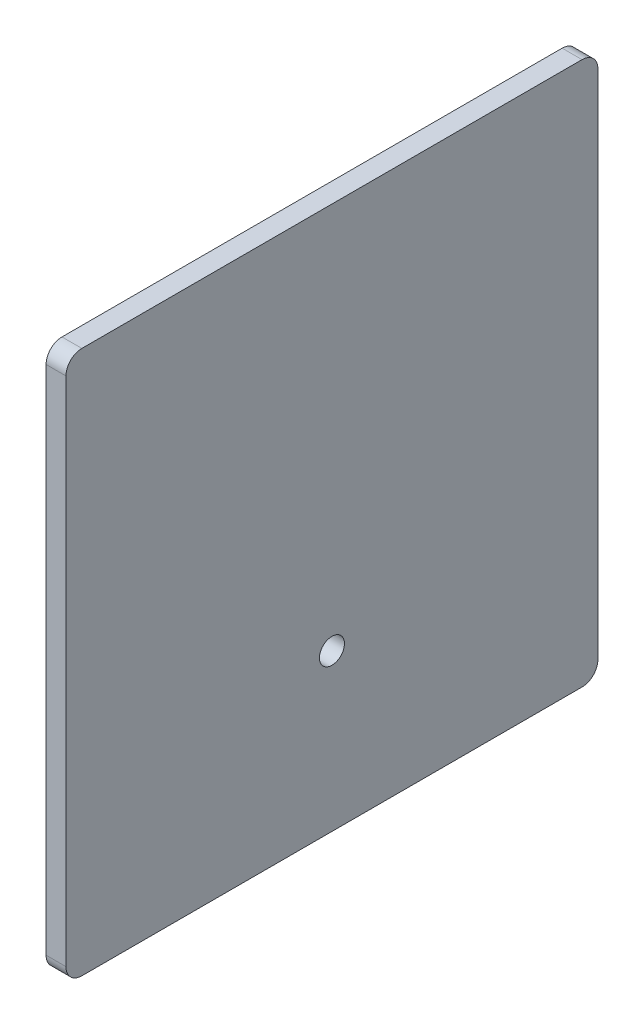
ISO-10303-21;
HEADER;
FILE_DESCRIPTION(('STEP AP214'),'2;1');
FILE_NAME('part.step','',(''),(''),'','','');
FILE_SCHEMA(('AUTOMOTIVE_DESIGN { 1 0 10303 214 1 1 1 1 }'));
ENDSEC;
DATA;
#1=APPLICATION_CONTEXT('core data for automotive mechanical design processes');
#2=APPLICATION_PROTOCOL_DEFINITION('international standard','automotive_design',2000,#1);
#3=PRODUCT_CONTEXT('',#1,'mechanical');
#4=PRODUCT('Part','Part','',(#3));
#5=PRODUCT_RELATED_PRODUCT_CATEGORY('part','',(#4));
#6=PRODUCT_DEFINITION_FORMATION('','',#4);
#7=PRODUCT_DEFINITION_CONTEXT('part definition',#1,'design');
#8=PRODUCT_DEFINITION('design','',#6,#7);
#9=PRODUCT_DEFINITION_SHAPE('','',#8);
#10=(LENGTH_UNIT() NAMED_UNIT(*) SI_UNIT(.MILLI.,.METRE.));
#11=(NAMED_UNIT(*) PLANE_ANGLE_UNIT() SI_UNIT($,.RADIAN.));
#12=(NAMED_UNIT(*) SI_UNIT($,.STERADIAN.) SOLID_ANGLE_UNIT());
#13=UNCERTAINTY_MEASURE_WITH_UNIT(LENGTH_MEASURE(1.E-05),#10,'distance_accuracy_value','');
#14=(GEOMETRIC_REPRESENTATION_CONTEXT(3) GLOBAL_UNCERTAINTY_ASSIGNED_CONTEXT((#13)) GLOBAL_UNIT_ASSIGNED_CONTEXT((#10,
#11,#12)) REPRESENTATION_CONTEXT('',''));
#15=CARTESIAN_POINT('',(0.,0.,0.));
#16=DIRECTION('',(0.,0.,1.));
#17=DIRECTION('',(1.,0.,0.));
#18=AXIS2_PLACEMENT_3D('',#15,#16,#17);
#19=CARTESIAN_POINT('',(3.175,-43.4125000430001,42.4999999629999));
#20=DIRECTION('',(0.,0.,-1.));
#21=DIRECTION('',(-1.,0.,0.));
#22=AXIS2_PLACEMENT_3D('',#19,#20,#21);
#23=PLANE('',#22);
#24=DIRECTION('',(0.,-1.,0.));
#25=VECTOR('',#24,1.);
#26=CARTESIAN_POINT('',(0.,-43.4125000430001,42.4999999629999));
#27=LINE('',#26,#25);
#28=CARTESIAN_POINT('',(0.,40.8725000429999,42.4999999629999));
#29=VERTEX_POINT('',#28);
#30=CARTESIAN_POINT('',(0.,-40.8725000430001,42.4999999629999));
#31=VERTEX_POINT('',#30);
#32=EDGE_CURVE('E139',#29,#31,#27,.T.);
#33=ORIENTED_EDGE('',*,*,#32,.T.);
#34=DIRECTION('',(-1.,0.,0.));
#35=VECTOR('',#34,1.);
#36=CARTESIAN_POINT('',(3.175,-40.8725000430001,42.4999999629999));
#37=LINE('',#36,#35);
#38=CARTESIAN_POINT('',(3.175,-40.8725000430001,42.4999999629999));
#39=VERTEX_POINT('',#38);
#40=EDGE_CURVE('E114',#31,#39,#37,.F.);
#41=ORIENTED_EDGE('',*,*,#40,.T.);
#42=DIRECTION('',(0.,-1.,0.));
#43=VECTOR('',#42,1.);
#44=CARTESIAN_POINT('',(3.175,-43.4125000430001,42.4999999629999));
#45=LINE('',#44,#43);
#46=CARTESIAN_POINT('',(3.175,40.8725000429999,42.4999999629999));
#47=VERTEX_POINT('',#46);
#48=EDGE_CURVE('E152',#47,#39,#45,.T.);
#49=ORIENTED_EDGE('',*,*,#48,.F.);
#50=DIRECTION('',(-1.,0.,0.));
#51=VECTOR('',#50,1.);
#52=CARTESIAN_POINT('',(3.175,40.8725000429999,42.4999999629999));
#53=LINE('',#52,#51);
#54=EDGE_CURVE('E120',#47,#29,#53,.T.);
#55=ORIENTED_EDGE('',*,*,#54,.T.);
#56=EDGE_LOOP('',(#33,#41,#49,#55));
#57=FACE_BOUND('',#56,.T.);
#58=ADVANCED_FACE('F42',(#57),#23,.F.);
#59=CARTESIAN_POINT('',(3.175,-43.4125000430001,-42.4999999630001));
#60=DIRECTION('',(0.,1.,0.));
#61=DIRECTION('',(0.,0.,1.));
#62=AXIS2_PLACEMENT_3D('',#59,#60,#61);
#63=PLANE('',#62);
#64=DIRECTION('',(0.,0.,-1.));
#65=VECTOR('',#64,1.);
#66=CARTESIAN_POINT('',(3.175,-43.4125000430001,-42.4999999630001));
#67=LINE('',#66,#65);
#68=CARTESIAN_POINT('',(3.175,-43.4125000430001,39.9599999629999));
#69=VERTEX_POINT('',#68);
#70=CARTESIAN_POINT('',(3.175,-43.4125000430001,-39.9599999630001));
#71=VERTEX_POINT('',#70);
#72=EDGE_CURVE('E130',#69,#71,#67,.T.);
#73=ORIENTED_EDGE('',*,*,#72,.F.);
#74=DIRECTION('',(-1.,0.,0.));
#75=VECTOR('',#74,1.);
#76=CARTESIAN_POINT('',(3.175,-43.4125000430001,39.9599999629999));
#77=LINE('',#76,#75);
#78=CARTESIAN_POINT('',(0.,-43.4125000430001,39.9599999629999));
#79=VERTEX_POINT('',#78);
#80=EDGE_CURVE('E113',#69,#79,#77,.T.);
#81=ORIENTED_EDGE('',*,*,#80,.T.);
#82=DIRECTION('',(0.,0.,-1.));
#83=VECTOR('',#82,1.);
#84=CARTESIAN_POINT('',(0.,-43.4125000430001,-42.4999999630001));
#85=LINE('',#84,#83);
#86=CARTESIAN_POINT('',(0.,-43.4125000430001,-39.9599999630001));
#87=VERTEX_POINT('',#86);
#88=EDGE_CURVE('E127',#79,#87,#85,.T.);
#89=ORIENTED_EDGE('',*,*,#88,.T.);
#90=DIRECTION('',(-1.,0.,0.));
#91=VECTOR('',#90,1.);
#92=CARTESIAN_POINT('',(3.175,-43.4125000430001,-39.9599999630001));
#93=LINE('',#92,#91);
#94=EDGE_CURVE('E133',#87,#71,#93,.F.);
#95=ORIENTED_EDGE('',*,*,#94,.T.);
#96=EDGE_LOOP('',(#73,#81,#89,#95));
#97=FACE_BOUND('',#96,.T.);
#98=ADVANCED_FACE('F126',(#97),#63,.F.);
#99=CARTESIAN_POINT('',(3.175,-43.4125000430001,-42.4999999630001));
#100=DIRECTION('',(0.,0.,1.));
#101=DIRECTION('',(1.,0.,0.));
#102=AXIS2_PLACEMENT_3D('',#99,#100,#101);
#103=PLANE('',#102);
#104=DIRECTION('',(0.,1.,0.));
#105=VECTOR('',#104,1.);
#106=CARTESIAN_POINT('',(3.175,-43.4125000430001,-42.4999999630001));
#107=LINE('',#106,#105);
#108=CARTESIAN_POINT('',(3.175,-40.8725000430001,-42.4999999630001));
#109=VERTEX_POINT('',#108);
#110=CARTESIAN_POINT('',(3.175,40.8725000429999,-42.4999999630001));
#111=VERTEX_POINT('',#110);
#112=EDGE_CURVE('E188',#109,#111,#107,.T.);
#113=ORIENTED_EDGE('',*,*,#112,.F.);
#114=DIRECTION('',(-1.,0.,0.));
#115=VECTOR('',#114,1.);
#116=CARTESIAN_POINT('',(3.175,-40.8725000430001,-42.4999999630001));
#117=LINE('',#116,#115);
#118=CARTESIAN_POINT('',(0.,-40.8725000430001,-42.4999999630001));
#119=VERTEX_POINT('',#118);
#120=EDGE_CURVE('E182',#109,#119,#117,.T.);
#121=ORIENTED_EDGE('',*,*,#120,.T.);
#122=DIRECTION('',(0.,1.,0.));
#123=VECTOR('',#122,1.);
#124=CARTESIAN_POINT('',(0.,-43.4125000430001,-42.4999999630001));
#125=LINE('',#124,#123);
#126=CARTESIAN_POINT('',(0.,40.8725000429999,-42.4999999630001));
#127=VERTEX_POINT('',#126);
#128=EDGE_CURVE('E138',#119,#127,#125,.T.);
#129=ORIENTED_EDGE('',*,*,#128,.T.);
#130=DIRECTION('',(-1.,0.,0.));
#131=VECTOR('',#130,1.);
#132=CARTESIAN_POINT('',(3.175,40.8725000429999,-42.4999999630001));
#133=LINE('',#132,#131);
#134=EDGE_CURVE('E179',#127,#111,#133,.F.);
#135=ORIENTED_EDGE('',*,*,#134,.T.);
#136=EDGE_LOOP('',(#113,#121,#129,#135));
#137=FACE_BOUND('',#136,.T.);
#138=ADVANCED_FACE('F221',(#137),#103,.F.);
#139=CARTESIAN_POINT('',(3.175,43.4125000429999,-42.4999999630001));
#140=DIRECTION('',(0.,-1.,0.));
#141=DIRECTION('',(0.,0.,-1.));
#142=AXIS2_PLACEMENT_3D('',#139,#140,#141);
#143=PLANE('',#142);
#144=DIRECTION('',(0.,0.,1.));
#145=VECTOR('',#144,1.);
#146=CARTESIAN_POINT('',(3.175,43.4125000429999,-42.4999999630001));
#147=LINE('',#146,#145);
#148=CARTESIAN_POINT('',(3.175,43.4125000429999,-39.9599999630001));
#149=VERTEX_POINT('',#148);
#150=CARTESIAN_POINT('',(3.175,43.4125000429999,39.9599999629999));
#151=VERTEX_POINT('',#150);
#152=EDGE_CURVE('E154',#149,#151,#147,.T.);
#153=ORIENTED_EDGE('',*,*,#152,.F.);
#154=DIRECTION('',(-1.,0.,0.));
#155=VECTOR('',#154,1.);
#156=CARTESIAN_POINT('',(3.175,43.4125000429999,-39.9599999630001));
#157=LINE('',#156,#155);
#158=CARTESIAN_POINT('',(0.,43.4125000429999,-39.9599999630001));
#159=VERTEX_POINT('',#158);
#160=EDGE_CURVE('E11',#149,#159,#157,.T.);
#161=ORIENTED_EDGE('',*,*,#160,.T.);
#162=DIRECTION('',(0.,0.,1.));
#163=VECTOR('',#162,1.);
#164=CARTESIAN_POINT('',(0.,43.4125000429999,-42.4999999630001));
#165=LINE('',#164,#163);
#166=CARTESIAN_POINT('',(0.,43.4125000429999,39.9599999629999));
#167=VERTEX_POINT('',#166);
#168=EDGE_CURVE('E144',#159,#167,#165,.T.);
#169=ORIENTED_EDGE('',*,*,#168,.T.);
#170=DIRECTION('',(-1.,0.,0.));
#171=VECTOR('',#170,1.);
#172=CARTESIAN_POINT('',(3.175,43.4125000429999,39.9599999629999));
#173=LINE('',#172,#171);
#174=EDGE_CURVE('E51',#167,#151,#173,.F.);
#175=ORIENTED_EDGE('',*,*,#174,.T.);
#176=EDGE_LOOP('',(#153,#161,#169,#175));
#177=FACE_BOUND('',#176,.T.);
#178=ADVANCED_FACE('F214',(#177),#143,.F.);
#179=CARTESIAN_POINT('',(3.175,0.,0.));
#180=DIRECTION('',(1.,0.,0.));
#181=DIRECTION('',(0.,0.,-1.));
#182=AXIS2_PLACEMENT_3D('',#179,#180,#181);
#183=PLANE('',#182);
#184=CARTESIAN_POINT('',(3.175,-18.4125000430001,-3.70000766136691E-08));
#185=DIRECTION('',(1.,0.,0.));
#186=DIRECTION('',(0.,0.,-1.));
#187=AXIS2_PLACEMENT_3D('',#184,#185,#186);
#188=CIRCLE('',#187,2.);
#189=CARTESIAN_POINT('',(3.175,-18.4125000430001,-2.00000003700008));
#190=VERTEX_POINT('',#189);
#191=EDGE_CURVE('E197',#190,#190,#188,.T.);
#192=ORIENTED_EDGE('',*,*,#191,.F.);
#193=EDGE_LOOP('',(#192));
#194=FACE_BOUND('',#193,.T.);
#195=ORIENTED_EDGE('',*,*,#48,.T.);
#196=CARTESIAN_POINT('',(3.175,-40.8725000430001,39.9599999629999));
#197=DIRECTION('',(1.,0.,0.));
#198=DIRECTION('',(0.,0.,-1.));
#199=AXIS2_PLACEMENT_3D('',#196,#197,#198);
#200=CIRCLE('',#199,2.54);
#201=EDGE_CURVE('E176',#39,#69,#200,.T.);
#202=ORIENTED_EDGE('',*,*,#201,.T.);
#203=ORIENTED_EDGE('',*,*,#72,.T.);
#204=CARTESIAN_POINT('',(3.175,-40.8725000430001,-39.9599999630001));
#205=DIRECTION('',(1.,0.,0.));
#206=DIRECTION('',(0.,0.,-1.));
#207=AXIS2_PLACEMENT_3D('',#204,#205,#206);
#208=CIRCLE('',#207,2.54);
#209=EDGE_CURVE('E173',#71,#109,#208,.T.);
#210=ORIENTED_EDGE('',*,*,#209,.T.);
#211=ORIENTED_EDGE('',*,*,#112,.T.);
#212=CARTESIAN_POINT('',(3.175,40.8725000429999,-39.9599999630001));
#213=DIRECTION('',(1.,0.,0.));
#214=DIRECTION('',(0.,0.,-1.));
#215=AXIS2_PLACEMENT_3D('',#212,#213,#214);
#216=CIRCLE('',#215,2.54);
#217=EDGE_CURVE('E64',#111,#149,#216,.T.);
#218=ORIENTED_EDGE('',*,*,#217,.T.);
#219=ORIENTED_EDGE('',*,*,#152,.T.);
#220=CARTESIAN_POINT('',(3.175,40.8725000429999,39.9599999629999));
#221=DIRECTION('',(1.,0.,0.));
#222=DIRECTION('',(0.,0.,-1.));
#223=AXIS2_PLACEMENT_3D('',#220,#221,#222);
#224=CIRCLE('',#223,2.54);
#225=EDGE_CURVE('E168',#151,#47,#224,.T.);
#226=ORIENTED_EDGE('',*,*,#225,.T.);
#227=EDGE_LOOP('',(#195,#202,#203,#210,#211,#218,#219,#226));
#228=FACE_BOUND('',#227,.T.);
#229=ADVANCED_FACE('F212',(#194,#228),#183,.T.);
#230=CARTESIAN_POINT('',(0.,0.,0.));
#231=DIRECTION('',(1.,0.,0.));
#232=DIRECTION('',(0.,0.,-1.));
#233=AXIS2_PLACEMENT_3D('',#230,#231,#232);
#234=PLANE('',#233);
#235=CARTESIAN_POINT('',(0.,-18.4125000430001,-3.70000766136691E-08));
#236=DIRECTION('',(1.,0.,0.));
#237=DIRECTION('',(0.,0.,-1.));
#238=AXIS2_PLACEMENT_3D('',#235,#236,#237);
#239=CIRCLE('',#238,2.);
#240=CARTESIAN_POINT('',(0.,-18.4125000430001,-2.00000003700008));
#241=VERTEX_POINT('',#240);
#242=EDGE_CURVE('E146',#241,#241,#239,.T.);
#243=ORIENTED_EDGE('',*,*,#242,.T.);
#244=EDGE_LOOP('',(#243));
#245=FACE_BOUND('',#244,.T.);
#246=ORIENTED_EDGE('',*,*,#88,.F.);
#247=CARTESIAN_POINT('',(0.,-40.8725000430001,39.9599999629999));
#248=DIRECTION('',(1.,0.,0.));
#249=DIRECTION('',(0.,0.,-1.));
#250=AXIS2_PLACEMENT_3D('',#247,#248,#249);
#251=CIRCLE('',#250,2.54);
#252=EDGE_CURVE('E109',#79,#31,#251,.F.);
#253=ORIENTED_EDGE('',*,*,#252,.T.);
#254=ORIENTED_EDGE('',*,*,#32,.F.);
#255=CARTESIAN_POINT('',(0.,40.8725000429999,39.9599999629999));
#256=DIRECTION('',(1.,0.,0.));
#257=DIRECTION('',(0.,0.,-1.));
#258=AXIS2_PLACEMENT_3D('',#255,#256,#257);
#259=CIRCLE('',#258,2.54);
#260=EDGE_CURVE('E132',#29,#167,#259,.F.);
#261=ORIENTED_EDGE('',*,*,#260,.T.);
#262=ORIENTED_EDGE('',*,*,#168,.F.);
#263=CARTESIAN_POINT('',(0.,40.8725000429999,-39.9599999630001));
#264=DIRECTION('',(1.,0.,0.));
#265=DIRECTION('',(0.,0.,-1.));
#266=AXIS2_PLACEMENT_3D('',#263,#264,#265);
#267=CIRCLE('',#266,2.54);
#268=EDGE_CURVE('E158',#159,#127,#267,.F.);
#269=ORIENTED_EDGE('',*,*,#268,.T.);
#270=ORIENTED_EDGE('',*,*,#128,.F.);
#271=CARTESIAN_POINT('',(0.,-40.8725000430001,-39.9599999630001));
#272=DIRECTION('',(1.,0.,0.));
#273=DIRECTION('',(0.,0.,-1.));
#274=AXIS2_PLACEMENT_3D('',#271,#272,#273);
#275=CIRCLE('',#274,2.54);
#276=EDGE_CURVE('E121',#119,#87,#275,.F.);
#277=ORIENTED_EDGE('',*,*,#276,.T.);
#278=EDGE_LOOP('',(#246,#253,#254,#261,#262,#269,#270,#277));
#279=FACE_BOUND('',#278,.T.);
#280=ADVANCED_FACE('F135',(#245,#279),#234,.F.);
#281=CARTESIAN_POINT('',(0.,-18.4125000430001,-3.70000766136691E-08));
#282=DIRECTION('',(1.,0.,0.));
#283=DIRECTION('',(0.,0.,-1.));
#284=AXIS2_PLACEMENT_3D('',#281,#282,#283);
#285=CYLINDRICAL_SURFACE('',#284,2.);
#286=ORIENTED_EDGE('',*,*,#242,.F.);
#287=EDGE_LOOP('',(#286));
#288=FACE_BOUND('',#287,.T.);
#289=ORIENTED_EDGE('',*,*,#191,.T.);
#290=EDGE_LOOP('',(#289));
#291=FACE_BOUND('',#290,.T.);
#292=ADVANCED_FACE('F206',(#288,#291),#285,.F.);
#293=CARTESIAN_POINT('',(3.175,-40.8725000430001,39.9599999629999));
#294=DIRECTION('',(-1.,0.,0.));
#295=DIRECTION('',(0.,0.,1.));
#296=AXIS2_PLACEMENT_3D('',#293,#294,#295);
#297=CYLINDRICAL_SURFACE('',#296,2.54);
#298=ORIENTED_EDGE('',*,*,#201,.F.);
#299=ORIENTED_EDGE('',*,*,#40,.F.);
#300=ORIENTED_EDGE('',*,*,#252,.F.);
#301=ORIENTED_EDGE('',*,*,#80,.F.);
#302=EDGE_LOOP('',(#298,#299,#300,#301));
#303=FACE_BOUND('',#302,.T.);
#304=ADVANCED_FACE('F112',(#303),#297,.T.);
#305=CARTESIAN_POINT('',(3.175,-40.8725000430001,-39.9599999630001));
#306=DIRECTION('',(-1.,0.,0.));
#307=DIRECTION('',(0.,0.,1.));
#308=AXIS2_PLACEMENT_3D('',#305,#306,#307);
#309=CYLINDRICAL_SURFACE('',#308,2.54);
#310=ORIENTED_EDGE('',*,*,#209,.F.);
#311=ORIENTED_EDGE('',*,*,#94,.F.);
#312=ORIENTED_EDGE('',*,*,#276,.F.);
#313=ORIENTED_EDGE('',*,*,#120,.F.);
#314=EDGE_LOOP('',(#310,#311,#312,#313));
#315=FACE_BOUND('',#314,.T.);
#316=ADVANCED_FACE('F234',(#315),#309,.T.);
#317=CARTESIAN_POINT('',(3.175,40.8725000429999,-39.9599999630001));
#318=DIRECTION('',(-1.,0.,0.));
#319=DIRECTION('',(0.,0.,1.));
#320=AXIS2_PLACEMENT_3D('',#317,#318,#319);
#321=CYLINDRICAL_SURFACE('',#320,2.54);
#322=ORIENTED_EDGE('',*,*,#217,.F.);
#323=ORIENTED_EDGE('',*,*,#134,.F.);
#324=ORIENTED_EDGE('',*,*,#268,.F.);
#325=ORIENTED_EDGE('',*,*,#160,.F.);
#326=EDGE_LOOP('',(#322,#323,#324,#325));
#327=FACE_BOUND('',#326,.T.);
#328=ADVANCED_FACE('F236',(#327),#321,.T.);
#329=CARTESIAN_POINT('',(3.175,40.8725000429999,39.9599999629999));
#330=DIRECTION('',(-1.,0.,0.));
#331=DIRECTION('',(0.,0.,1.));
#332=AXIS2_PLACEMENT_3D('',#329,#330,#331);
#333=CYLINDRICAL_SURFACE('',#332,2.54);
#334=ORIENTED_EDGE('',*,*,#225,.F.);
#335=ORIENTED_EDGE('',*,*,#174,.F.);
#336=ORIENTED_EDGE('',*,*,#260,.F.);
#337=ORIENTED_EDGE('',*,*,#54,.F.);
#338=EDGE_LOOP('',(#334,#335,#336,#337));
#339=FACE_BOUND('',#338,.T.);
#340=ADVANCED_FACE('F44',(#339),#333,.T.);
#341=CLOSED_SHELL('',(#58,#98,#138,#178,#229,#280,#292,#304,#316,#328,#340));
#342=MANIFOLD_SOLID_BREP('B2',#341);
#343=ADVANCED_BREP_SHAPE_REPRESENTATION('',(#18,#342),#14);
#344=SHAPE_DEFINITION_REPRESENTATION(#9,#343);
ENDSEC;
END-ISO-10303-21;
